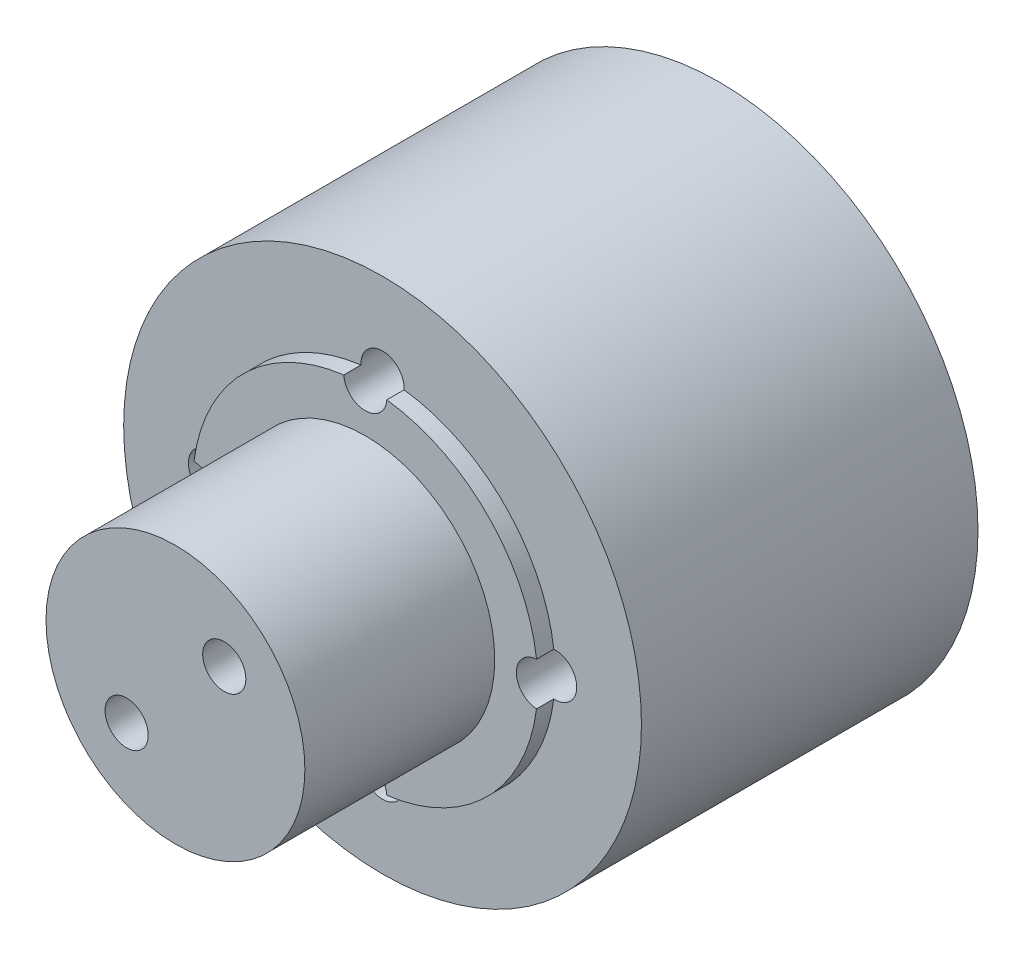
ISO-10303-21;
HEADER;
FILE_DESCRIPTION(('STEP AP214'),'2;1');
FILE_NAME('part.step','',(''),(''),'','','');
FILE_SCHEMA(('AUTOMOTIVE_DESIGN { 1 0 10303 214 1 1 1 1 }'));
ENDSEC;
DATA;
#1=APPLICATION_CONTEXT('core data for automotive mechanical design processes');
#2=APPLICATION_PROTOCOL_DEFINITION('international standard','automotive_design',2000,#1);
#3=PRODUCT_CONTEXT('',#1,'mechanical');
#4=PRODUCT('Part','Part','',(#3));
#5=PRODUCT_RELATED_PRODUCT_CATEGORY('part','',(#4));
#6=PRODUCT_DEFINITION_FORMATION('','',#4);
#7=PRODUCT_DEFINITION_CONTEXT('part definition',#1,'design');
#8=PRODUCT_DEFINITION('design','',#6,#7);
#9=PRODUCT_DEFINITION_SHAPE('','',#8);
#10=(LENGTH_UNIT() NAMED_UNIT(*) SI_UNIT(.MILLI.,.METRE.));
#11=(NAMED_UNIT(*) PLANE_ANGLE_UNIT() SI_UNIT($,.RADIAN.));
#12=(NAMED_UNIT(*) SI_UNIT($,.STERADIAN.) SOLID_ANGLE_UNIT());
#13=UNCERTAINTY_MEASURE_WITH_UNIT(LENGTH_MEASURE(1.E-05),#10,'distance_accuracy_value','');
#14=(GEOMETRIC_REPRESENTATION_CONTEXT(3) GLOBAL_UNCERTAINTY_ASSIGNED_CONTEXT((#13)) GLOBAL_UNIT_ASSIGNED_CONTEXT((#10,
#11,#12)) REPRESENTATION_CONTEXT('',''));
#15=CARTESIAN_POINT('',(0.,0.,0.));
#16=DIRECTION('',(0.,0.,1.));
#17=DIRECTION('',(1.,0.,0.));
#18=AXIS2_PLACEMENT_3D('',#15,#16,#17);
#19=CARTESIAN_POINT('',(0.,0.,20.5));
#20=DIRECTION('',(0.,0.,-1.));
#21=DIRECTION('',(-1.,0.,0.));
#22=AXIS2_PLACEMENT_3D('',#19,#20,#21);
#23=CYLINDRICAL_SURFACE('',#22,10.);
#24=CARTESIAN_POINT('',(0.,0.,19.5));
#25=DIRECTION('',(0.,0.,1.));
#26=DIRECTION('',(1.,0.,0.));
#27=AXIS2_PLACEMENT_3D('',#24,#25,#26);
#28=CIRCLE('',#27,10.);
#29=CARTESIAN_POINT('',(9.921875,1.24755620489619,19.5));
#30=VERTEX_POINT('',#29);
#31=CARTESIAN_POINT('',(1.2475562048962,9.921875,19.5));
#32=VERTEX_POINT('',#31);
#33=EDGE_CURVE('E180',#30,#32,#28,.T.);
#34=ORIENTED_EDGE('',*,*,#33,.T.);
#35=DIRECTION('',(0.,0.,-1.));
#36=VECTOR('',#35,1.);
#37=CARTESIAN_POINT('',(1.24755620489619,9.921875,15.75));
#38=LINE('',#37,#36);
#39=CARTESIAN_POINT('',(1.24755620489619,9.921875,20.5));
#40=VERTEX_POINT('',#39);
#41=EDGE_CURVE('E54',#32,#40,#38,.F.);
#42=ORIENTED_EDGE('',*,*,#41,.T.);
#43=CARTESIAN_POINT('',(0.,0.,20.5));
#44=DIRECTION('',(0.,0.,1.));
#45=DIRECTION('',(1.,0.,0.));
#46=AXIS2_PLACEMENT_3D('',#43,#44,#45);
#47=CIRCLE('',#46,10.);
#48=CARTESIAN_POINT('',(9.921875,1.24755620489619,20.5));
#49=VERTEX_POINT('',#48);
#50=EDGE_CURVE('E174',#49,#40,#47,.T.);
#51=ORIENTED_EDGE('',*,*,#50,.F.);
#52=DIRECTION('',(0.,0.,-1.));
#53=VECTOR('',#52,1.);
#54=CARTESIAN_POINT('',(9.921875,1.24755620489619,15.75));
#55=LINE('',#54,#53);
#56=EDGE_CURVE('E193',#49,#30,#55,.T.);
#57=ORIENTED_EDGE('',*,*,#56,.T.);
#58=EDGE_LOOP('',(#34,#42,#51,#57));
#59=FACE_BOUND('',#58,.T.);
#60=ADVANCED_FACE('F39',(#59),#23,.T.);
#61=CARTESIAN_POINT('',(-1.24755620489619,9.921875,20.5));
#62=VERTEX_POINT('',#61);
#63=CARTESIAN_POINT('',(-9.921875,1.2475562048962,20.5));
#64=VERTEX_POINT('',#63);
#65=EDGE_CURVE('E175',#62,#64,#47,.T.);
#66=ORIENTED_EDGE('',*,*,#65,.F.);
#67=DIRECTION('',(0.,0.,-1.));
#68=VECTOR('',#67,1.);
#69=CARTESIAN_POINT('',(-1.24755620489619,9.921875,15.75));
#70=LINE('',#69,#68);
#71=CARTESIAN_POINT('',(-1.2475562048962,9.921875,19.5));
#72=VERTEX_POINT('',#71);
#73=EDGE_CURVE('E135',#62,#72,#70,.T.);
#74=ORIENTED_EDGE('',*,*,#73,.T.);
#75=CARTESIAN_POINT('',(-9.921875,1.2475562048962,19.5));
#76=VERTEX_POINT('',#75);
#77=EDGE_CURVE('E181',#72,#76,#28,.T.);
#78=ORIENTED_EDGE('',*,*,#77,.T.);
#79=DIRECTION('',(0.,0.,-1.));
#80=VECTOR('',#79,1.);
#81=CARTESIAN_POINT('',(-9.921875,1.24755620489619,15.75));
#82=LINE('',#81,#80);
#83=EDGE_CURVE('E11',#76,#64,#82,.F.);
#84=ORIENTED_EDGE('',*,*,#83,.T.);
#85=EDGE_LOOP('',(#66,#74,#78,#84));
#86=FACE_BOUND('',#85,.T.);
#87=ADVANCED_FACE('F221',(#86),#23,.T.);
#88=CARTESIAN_POINT('',(1.24755620489619,-9.921875,19.5));
#89=VERTEX_POINT('',#88);
#90=CARTESIAN_POINT('',(9.921875,-1.2475562048962,19.5));
#91=VERTEX_POINT('',#90);
#92=EDGE_CURVE('E176',#89,#91,#28,.T.);
#93=ORIENTED_EDGE('',*,*,#92,.T.);
#94=DIRECTION('',(0.,0.,-1.));
#95=VECTOR('',#94,1.);
#96=CARTESIAN_POINT('',(9.921875,-1.24755620489619,15.75));
#97=LINE('',#96,#95);
#98=CARTESIAN_POINT('',(9.921875,-1.2475562048962,20.5));
#99=VERTEX_POINT('',#98);
#100=EDGE_CURVE('E196',#91,#99,#97,.F.);
#101=ORIENTED_EDGE('',*,*,#100,.T.);
#102=CARTESIAN_POINT('',(1.24755620489619,-9.921875,20.5));
#103=VERTEX_POINT('',#102);
#104=EDGE_CURVE('E170',#103,#99,#47,.T.);
#105=ORIENTED_EDGE('',*,*,#104,.F.);
#106=DIRECTION('',(0.,0.,-1.));
#107=VECTOR('',#106,1.);
#108=CARTESIAN_POINT('',(1.24755620489619,-9.921875,15.75));
#109=LINE('',#108,#107);
#110=EDGE_CURVE('E185',#103,#89,#109,.T.);
#111=ORIENTED_EDGE('',*,*,#110,.T.);
#112=EDGE_LOOP('',(#93,#101,#105,#111));
#113=FACE_BOUND('',#112,.T.);
#114=ADVANCED_FACE('F230',(#113),#23,.T.);
#115=CARTESIAN_POINT('',(0.,0.,20.5));
#116=DIRECTION('',(0.,0.,1.));
#117=DIRECTION('',(1.,0.,0.));
#118=AXIS2_PLACEMENT_3D('',#115,#116,#117);
#119=PLANE('',#118);
#120=CARTESIAN_POINT('',(0.,10.,20.5));
#121=DIRECTION('',(0.,0.,1.));
#122=DIRECTION('',(1.,0.,0.));
#123=AXIS2_PLACEMENT_3D('',#120,#121,#122);
#124=CIRCLE('',#123,1.24999999999999);
#125=EDGE_CURVE('E139',#62,#40,#124,.T.);
#126=ORIENTED_EDGE('',*,*,#125,.F.);
#127=ORIENTED_EDGE('',*,*,#65,.T.);
#128=CARTESIAN_POINT('',(-10.,0.,20.5));
#129=DIRECTION('',(0.,0.,1.));
#130=DIRECTION('',(1.,0.,0.));
#131=AXIS2_PLACEMENT_3D('',#128,#129,#130);
#132=CIRCLE('',#131,1.24999999999999);
#133=CARTESIAN_POINT('',(-9.921875,-1.24755620489619,20.5));
#134=VERTEX_POINT('',#133);
#135=EDGE_CURVE('E145',#134,#64,#132,.T.);
#136=ORIENTED_EDGE('',*,*,#135,.F.);
#137=CARTESIAN_POINT('',(-1.2475562048962,-9.921875,20.5));
#138=VERTEX_POINT('',#137);
#139=EDGE_CURVE('E179',#134,#138,#47,.T.);
#140=ORIENTED_EDGE('',*,*,#139,.T.);
#141=CARTESIAN_POINT('',(0.,-10.,20.5));
#142=DIRECTION('',(0.,0.,1.));
#143=DIRECTION('',(1.,0.,0.));
#144=AXIS2_PLACEMENT_3D('',#141,#142,#143);
#145=CIRCLE('',#144,1.24999999999999);
#146=EDGE_CURVE('E160',#103,#138,#145,.T.);
#147=ORIENTED_EDGE('',*,*,#146,.F.);
#148=ORIENTED_EDGE('',*,*,#104,.T.);
#149=CARTESIAN_POINT('',(10.,0.,20.5));
#150=DIRECTION('',(0.,0.,1.));
#151=DIRECTION('',(1.,0.,0.));
#152=AXIS2_PLACEMENT_3D('',#149,#150,#151);
#153=CIRCLE('',#152,1.24999999999999);
#154=EDGE_CURVE('E153',#49,#99,#153,.T.);
#155=ORIENTED_EDGE('',*,*,#154,.F.);
#156=ORIENTED_EDGE('',*,*,#50,.T.);
#157=EDGE_LOOP('',(#126,#127,#136,#140,#147,#148,#155,#156));
#158=FACE_BOUND('',#157,.T.);
#159=CARTESIAN_POINT('',(0.,0.,20.5));
#160=DIRECTION('',(0.,0.,1.));
#161=DIRECTION('',(1.,0.,0.));
#162=AXIS2_PLACEMENT_3D('',#159,#160,#161);
#163=CIRCLE('',#162,7.5);
#164=CARTESIAN_POINT('',(7.5,0.,20.5));
#165=VERTEX_POINT('',#164);
#166=EDGE_CURVE('E163',#165,#165,#163,.T.);
#167=ORIENTED_EDGE('',*,*,#166,.F.);
#168=EDGE_LOOP('',(#167));
#169=FACE_BOUND('',#168,.T.);
#170=ADVANCED_FACE('F224',(#158,#169),#119,.T.);
#171=CARTESIAN_POINT('',(0.,0.,19.5));
#172=DIRECTION('',(0.,0.,1.));
#173=DIRECTION('',(1.,0.,0.));
#174=AXIS2_PLACEMENT_3D('',#171,#172,#173);
#175=PLANE('',#174);
#176=CARTESIAN_POINT('',(0.,10.,19.5));
#177=DIRECTION('',(0.,0.,1.));
#178=DIRECTION('',(1.,0.,0.));
#179=AXIS2_PLACEMENT_3D('',#176,#177,#178);
#180=CIRCLE('',#179,1.24999999999999);
#181=EDGE_CURVE('E133',#32,#72,#180,.T.);
#182=ORIENTED_EDGE('',*,*,#181,.F.);
#183=ORIENTED_EDGE('',*,*,#33,.F.);
#184=CARTESIAN_POINT('',(10.,0.,19.5));
#185=DIRECTION('',(0.,0.,1.));
#186=DIRECTION('',(1.,0.,0.));
#187=AXIS2_PLACEMENT_3D('',#184,#185,#186);
#188=CIRCLE('',#187,1.24999999999999);
#189=EDGE_CURVE('E151',#91,#30,#188,.T.);
#190=ORIENTED_EDGE('',*,*,#189,.F.);
#191=ORIENTED_EDGE('',*,*,#92,.F.);
#192=CARTESIAN_POINT('',(0.,-10.,19.5));
#193=DIRECTION('',(0.,0.,1.));
#194=DIRECTION('',(1.,0.,0.));
#195=AXIS2_PLACEMENT_3D('',#192,#193,#194);
#196=CIRCLE('',#195,1.24999999999999);
#197=CARTESIAN_POINT('',(-1.2475562048962,-9.921875,19.5));
#198=VERTEX_POINT('',#197);
#199=EDGE_CURVE('E158',#198,#89,#196,.T.);
#200=ORIENTED_EDGE('',*,*,#199,.F.);
#201=CARTESIAN_POINT('',(-9.921875,-1.24755620489619,19.5));
#202=VERTEX_POINT('',#201);
#203=EDGE_CURVE('E167',#202,#198,#28,.T.);
#204=ORIENTED_EDGE('',*,*,#203,.F.);
#205=CARTESIAN_POINT('',(-10.,0.,19.5));
#206=DIRECTION('',(0.,0.,1.));
#207=DIRECTION('',(1.,0.,0.));
#208=AXIS2_PLACEMENT_3D('',#205,#206,#207);
#209=CIRCLE('',#208,1.24999999999999);
#210=EDGE_CURVE('E62',#76,#202,#209,.T.);
#211=ORIENTED_EDGE('',*,*,#210,.F.);
#212=ORIENTED_EDGE('',*,*,#77,.F.);
#213=EDGE_LOOP('',(#182,#183,#190,#191,#200,#204,#211,#212));
#214=FACE_BOUND('',#213,.T.);
#215=CARTESIAN_POINT('',(0.,0.,19.5));
#216=DIRECTION('',(0.,0.,1.));
#217=DIRECTION('',(1.,0.,0.));
#218=AXIS2_PLACEMENT_3D('',#215,#216,#217);
#219=CIRCLE('',#218,15.);
#220=CARTESIAN_POINT('',(15.,0.,19.5));
#221=VERTEX_POINT('',#220);
#222=EDGE_CURVE('E182',#221,#221,#219,.T.);
#223=ORIENTED_EDGE('',*,*,#222,.T.);
#224=EDGE_LOOP('',(#223));
#225=FACE_BOUND('',#224,.T.);
#226=ADVANCED_FACE('F206',(#214,#225),#175,.T.);
#227=CARTESIAN_POINT('',(0.,0.,19.5));
#228=DIRECTION('',(0.,0.,-1.));
#229=DIRECTION('',(-1.,0.,0.));
#230=AXIS2_PLACEMENT_3D('',#227,#228,#229);
#231=CYLINDRICAL_SURFACE('',#230,15.);
#232=ORIENTED_EDGE('',*,*,#222,.F.);
#233=EDGE_LOOP('',(#232));
#234=FACE_BOUND('',#233,.T.);
#235=CARTESIAN_POINT('',(0.,0.,0.));
#236=DIRECTION('',(0.,0.,1.));
#237=DIRECTION('',(1.,0.,0.));
#238=AXIS2_PLACEMENT_3D('',#235,#236,#237);
#239=CIRCLE('',#238,15.);
#240=CARTESIAN_POINT('',(15.,0.,0.));
#241=VERTEX_POINT('',#240);
#242=EDGE_CURVE('E173',#241,#241,#239,.T.);
#243=ORIENTED_EDGE('',*,*,#242,.T.);
#244=EDGE_LOOP('',(#243));
#245=FACE_BOUND('',#244,.T.);
#246=ADVANCED_FACE('F41',(#234,#245),#231,.T.);
#247=CARTESIAN_POINT('',(0.,0.,0.));
#248=DIRECTION('',(0.,0.,1.));
#249=DIRECTION('',(1.,0.,0.));
#250=AXIS2_PLACEMENT_3D('',#247,#248,#249);
#251=PLANE('',#250);
#252=CARTESIAN_POINT('',(0.,10.,0.));
#253=DIRECTION('',(0.,0.,-1.));
#254=DIRECTION('',(-1.,0.,0.));
#255=AXIS2_PLACEMENT_3D('',#252,#253,#254);
#256=CIRCLE('',#255,1.25);
#257=CARTESIAN_POINT('',(-1.25,10.,0.));
#258=VERTEX_POINT('',#257);
#259=EDGE_CURVE('E130',#258,#258,#256,.T.);
#260=ORIENTED_EDGE('',*,*,#259,.F.);
#261=EDGE_LOOP('',(#260));
#262=FACE_BOUND('',#261,.T.);
#263=CARTESIAN_POINT('',(-10.,0.,0.));
#264=DIRECTION('',(0.,0.,-1.));
#265=DIRECTION('',(-1.,0.,0.));
#266=AXIS2_PLACEMENT_3D('',#263,#264,#265);
#267=CIRCLE('',#266,1.25);
#268=CARTESIAN_POINT('',(-11.25,0.,0.));
#269=VERTEX_POINT('',#268);
#270=EDGE_CURVE('E141',#269,#269,#267,.T.);
#271=ORIENTED_EDGE('',*,*,#270,.F.);
#272=EDGE_LOOP('',(#271));
#273=FACE_BOUND('',#272,.T.);
#274=CARTESIAN_POINT('',(10.,0.,0.));
#275=DIRECTION('',(0.,0.,-1.));
#276=DIRECTION('',(-1.,0.,0.));
#277=AXIS2_PLACEMENT_3D('',#274,#275,#276);
#278=CIRCLE('',#277,1.25);
#279=CARTESIAN_POINT('',(8.75,0.,0.));
#280=VERTEX_POINT('',#279);
#281=EDGE_CURVE('E148',#280,#280,#278,.T.);
#282=ORIENTED_EDGE('',*,*,#281,.F.);
#283=EDGE_LOOP('',(#282));
#284=FACE_BOUND('',#283,.T.);
#285=CARTESIAN_POINT('',(0.,-10.,0.));
#286=DIRECTION('',(0.,0.,-1.));
#287=DIRECTION('',(-1.,0.,0.));
#288=AXIS2_PLACEMENT_3D('',#285,#286,#287);
#289=CIRCLE('',#288,1.25);
#290=CARTESIAN_POINT('',(-1.25,-10.,0.));
#291=VERTEX_POINT('',#290);
#292=EDGE_CURVE('E155',#291,#291,#289,.T.);
#293=ORIENTED_EDGE('',*,*,#292,.F.);
#294=EDGE_LOOP('',(#293));
#295=FACE_BOUND('',#294,.T.);
#296=ORIENTED_EDGE('',*,*,#242,.F.);
#297=EDGE_LOOP('',(#296));
#298=FACE_BOUND('',#297,.T.);
#299=ADVANCED_FACE('F256',(#262,#273,#284,#295,#298),#251,.F.);
#300=ORIENTED_EDGE('',*,*,#139,.F.);
#301=DIRECTION('',(0.,0.,-1.));
#302=VECTOR('',#301,1.);
#303=CARTESIAN_POINT('',(-9.921875,-1.24755620489619,15.75));
#304=LINE('',#303,#302);
#305=EDGE_CURVE('E47',#134,#202,#304,.T.);
#306=ORIENTED_EDGE('',*,*,#305,.T.);
#307=ORIENTED_EDGE('',*,*,#203,.T.);
#308=DIRECTION('',(0.,0.,-1.));
#309=VECTOR('',#308,1.);
#310=CARTESIAN_POINT('',(-1.24755620489619,-9.921875,15.75));
#311=LINE('',#310,#309);
#312=EDGE_CURVE('E190',#198,#138,#311,.F.);
#313=ORIENTED_EDGE('',*,*,#312,.T.);
#314=EDGE_LOOP('',(#300,#306,#307,#313));
#315=FACE_BOUND('',#314,.T.);
#316=ADVANCED_FACE('F201',(#315),#23,.T.);
#317=CARTESIAN_POINT('',(0.,0.,31.5));
#318=DIRECTION('',(0.,0.,-1.));
#319=DIRECTION('',(-1.,0.,0.));
#320=AXIS2_PLACEMENT_3D('',#317,#318,#319);
#321=CYLINDRICAL_SURFACE('',#320,7.5);
#322=CARTESIAN_POINT('',(0.,0.,31.5));
#323=DIRECTION('',(0.,0.,1.));
#324=DIRECTION('',(1.,0.,0.));
#325=AXIS2_PLACEMENT_3D('',#322,#323,#324);
#326=CIRCLE('',#325,7.5);
#327=CARTESIAN_POINT('',(7.5,0.,31.5));
#328=VERTEX_POINT('',#327);
#329=EDGE_CURVE('E164',#328,#328,#326,.T.);
#330=ORIENTED_EDGE('',*,*,#329,.F.);
#331=EDGE_LOOP('',(#330));
#332=FACE_BOUND('',#331,.T.);
#333=ORIENTED_EDGE('',*,*,#166,.T.);
#334=EDGE_LOOP('',(#333));
#335=FACE_BOUND('',#334,.T.);
#336=ADVANCED_FACE('F255',(#332,#335),#321,.T.);
#337=CARTESIAN_POINT('',(0.,0.,31.5));
#338=DIRECTION('',(0.,0.,1.));
#339=DIRECTION('',(1.,0.,0.));
#340=AXIS2_PLACEMENT_3D('',#337,#338,#339);
#341=PLANE('',#340);
#342=CARTESIAN_POINT('',(-2.82842712474618,-2.82842712474619,31.5));
#343=DIRECTION('',(0.,0.,1.));
#344=DIRECTION('',(1.,0.,0.));
#345=AXIS2_PLACEMENT_3D('',#342,#343,#344);
#346=CIRCLE('',#345,1.24999999999999);
#347=CARTESIAN_POINT('',(-1.5784271247462,-2.82842712474619,31.5));
#348=VERTEX_POINT('',#347);
#349=EDGE_CURVE('E120',#348,#348,#346,.T.);
#350=ORIENTED_EDGE('',*,*,#349,.F.);
#351=EDGE_LOOP('',(#350));
#352=FACE_BOUND('',#351,.T.);
#353=CARTESIAN_POINT('',(2.82842712474618,2.8284271247462,31.5));
#354=DIRECTION('',(0.,0.,1.));
#355=DIRECTION('',(1.,0.,0.));
#356=AXIS2_PLACEMENT_3D('',#353,#354,#355);
#357=CIRCLE('',#356,1.24999999999999);
#358=CARTESIAN_POINT('',(4.07842712474617,2.8284271247462,31.5));
#359=VERTEX_POINT('',#358);
#360=EDGE_CURVE('E119',#359,#359,#357,.T.);
#361=ORIENTED_EDGE('',*,*,#360,.F.);
#362=EDGE_LOOP('',(#361));
#363=FACE_BOUND('',#362,.T.);
#364=ORIENTED_EDGE('',*,*,#329,.T.);
#365=EDGE_LOOP('',(#364));
#366=FACE_BOUND('',#365,.T.);
#367=ADVANCED_FACE('F244',(#352,#363,#366),#341,.T.);
#368=CARTESIAN_POINT('',(0.,-10.,0.));
#369=DIRECTION('',(0.,0.,-1.));
#370=DIRECTION('',(-1.,0.,0.));
#371=AXIS2_PLACEMENT_3D('',#368,#369,#370);
#372=CYLINDRICAL_SURFACE('',#371,1.24999999999999);
#373=ORIENTED_EDGE('',*,*,#292,.T.);
#374=EDGE_LOOP('',(#373));
#375=FACE_BOUND('',#374,.T.);
#376=ORIENTED_EDGE('',*,*,#199,.T.);
#377=ORIENTED_EDGE('',*,*,#110,.F.);
#378=ORIENTED_EDGE('',*,*,#146,.T.);
#379=ORIENTED_EDGE('',*,*,#312,.F.);
#380=EDGE_LOOP('',(#376,#377,#378,#379));
#381=FACE_BOUND('',#380,.T.);
#382=ADVANCED_FACE('F228',(#375,#381),#372,.F.);
#383=CARTESIAN_POINT('',(10.,0.,0.));
#384=DIRECTION('',(0.,0.,-1.));
#385=DIRECTION('',(-1.,0.,0.));
#386=AXIS2_PLACEMENT_3D('',#383,#384,#385);
#387=CYLINDRICAL_SURFACE('',#386,1.24999999999999);
#388=ORIENTED_EDGE('',*,*,#281,.T.);
#389=EDGE_LOOP('',(#388));
#390=FACE_BOUND('',#389,.T.);
#391=ORIENTED_EDGE('',*,*,#189,.T.);
#392=ORIENTED_EDGE('',*,*,#56,.F.);
#393=ORIENTED_EDGE('',*,*,#154,.T.);
#394=ORIENTED_EDGE('',*,*,#100,.F.);
#395=EDGE_LOOP('',(#391,#392,#393,#394));
#396=FACE_BOUND('',#395,.T.);
#397=ADVANCED_FACE('F233',(#390,#396),#387,.F.);
#398=CARTESIAN_POINT('',(-10.,0.,0.));
#399=DIRECTION('',(0.,0.,-1.));
#400=DIRECTION('',(-1.,0.,0.));
#401=AXIS2_PLACEMENT_3D('',#398,#399,#400);
#402=CYLINDRICAL_SURFACE('',#401,1.24999999999999);
#403=ORIENTED_EDGE('',*,*,#270,.T.);
#404=EDGE_LOOP('',(#403));
#405=FACE_BOUND('',#404,.T.);
#406=ORIENTED_EDGE('',*,*,#210,.T.);
#407=ORIENTED_EDGE('',*,*,#305,.F.);
#408=ORIENTED_EDGE('',*,*,#135,.T.);
#409=ORIENTED_EDGE('',*,*,#83,.F.);
#410=EDGE_LOOP('',(#406,#407,#408,#409));
#411=FACE_BOUND('',#410,.T.);
#412=ADVANCED_FACE('F235',(#405,#411),#402,.F.);
#413=CARTESIAN_POINT('',(0.,10.,0.));
#414=DIRECTION('',(0.,0.,-1.));
#415=DIRECTION('',(-1.,0.,0.));
#416=AXIS2_PLACEMENT_3D('',#413,#414,#415);
#417=CYLINDRICAL_SURFACE('',#416,1.24999999999999);
#418=ORIENTED_EDGE('',*,*,#125,.T.);
#419=ORIENTED_EDGE('',*,*,#41,.F.);
#420=ORIENTED_EDGE('',*,*,#181,.T.);
#421=ORIENTED_EDGE('',*,*,#73,.F.);
#422=EDGE_LOOP('',(#418,#419,#420,#421));
#423=FACE_BOUND('',#422,.T.);
#424=ORIENTED_EDGE('',*,*,#259,.T.);
#425=EDGE_LOOP('',(#424));
#426=FACE_BOUND('',#425,.T.);
#427=ADVANCED_FACE('F216',(#423,#426),#417,.F.);
#428=CARTESIAN_POINT('',(2.82842712474618,2.8284271247462,23.5));
#429=DIRECTION('',(0.,0.,1.));
#430=DIRECTION('',(1.,0.,0.));
#431=AXIS2_PLACEMENT_3D('',#428,#429,#430);
#432=CONICAL_SURFACE('',#431,1.25,1.02974425867665);
#433=CARTESIAN_POINT('',(2.82842712474618,2.8284271247462,22.7489242262155));
#434=VERTEX_POINT('',#433);
#435=VERTEX_LOOP('',#434);
#436=FACE_BOUND('',#435,.T.);
#437=CARTESIAN_POINT('',(2.82842712474618,2.8284271247462,23.5));
#438=DIRECTION('',(0.,0.,1.));
#439=DIRECTION('',(1.,0.,0.));
#440=AXIS2_PLACEMENT_3D('',#437,#438,#439);
#441=CIRCLE('',#440,1.25);
#442=CARTESIAN_POINT('',(4.07842712474618,2.8284271247462,23.5));
#443=VERTEX_POINT('',#442);
#444=EDGE_CURVE('E123',#443,#443,#441,.T.);
#445=ORIENTED_EDGE('',*,*,#444,.T.);
#446=EDGE_LOOP('',(#445));
#447=FACE_BOUND('',#446,.T.);
#448=ADVANCED_FACE('F285',(#436,#447),#432,.F.);
#449=CARTESIAN_POINT('',(2.82842712474618,2.8284271247462,31.5));
#450=DIRECTION('',(0.,0.,1.));
#451=DIRECTION('',(1.,0.,0.));
#452=AXIS2_PLACEMENT_3D('',#449,#450,#451);
#453=CYLINDRICAL_SURFACE('',#452,1.24999999999999);
#454=ORIENTED_EDGE('',*,*,#444,.F.);
#455=EDGE_LOOP('',(#454));
#456=FACE_BOUND('',#455,.T.);
#457=ORIENTED_EDGE('',*,*,#360,.T.);
#458=EDGE_LOOP('',(#457));
#459=FACE_BOUND('',#458,.T.);
#460=ADVANCED_FACE('F113',(#456,#459),#453,.F.);
#461=CARTESIAN_POINT('',(-2.82842712474618,-2.82842712474619,23.5));
#462=DIRECTION('',(0.,0.,1.));
#463=DIRECTION('',(1.,0.,0.));
#464=AXIS2_PLACEMENT_3D('',#461,#462,#463);
#465=CONICAL_SURFACE('',#464,1.25,1.02974425867665);
#466=CARTESIAN_POINT('',(-2.82842712474619,-2.82842712474619,22.7489242262155));
#467=VERTEX_POINT('',#466);
#468=VERTEX_LOOP('',#467);
#469=FACE_BOUND('',#468,.T.);
#470=CARTESIAN_POINT('',(-2.82842712474618,-2.82842712474619,23.5));
#471=DIRECTION('',(0.,0.,1.));
#472=DIRECTION('',(1.,0.,0.));
#473=AXIS2_PLACEMENT_3D('',#470,#471,#472);
#474=CIRCLE('',#473,1.25);
#475=CARTESIAN_POINT('',(-1.57842712474619,-2.82842712474619,23.5));
#476=VERTEX_POINT('',#475);
#477=EDGE_CURVE('E117',#476,#476,#474,.T.);
#478=ORIENTED_EDGE('',*,*,#477,.T.);
#479=EDGE_LOOP('',(#478));
#480=FACE_BOUND('',#479,.T.);
#481=ADVANCED_FACE('F109',(#469,#480),#465,.F.);
#482=CARTESIAN_POINT('',(-2.82842712474618,-2.82842712474619,31.5));
#483=DIRECTION('',(0.,0.,1.));
#484=DIRECTION('',(1.,0.,0.));
#485=AXIS2_PLACEMENT_3D('',#482,#483,#484);
#486=CYLINDRICAL_SURFACE('',#485,1.24999999999999);
#487=ORIENTED_EDGE('',*,*,#477,.F.);
#488=EDGE_LOOP('',(#487));
#489=FACE_BOUND('',#488,.T.);
#490=ORIENTED_EDGE('',*,*,#349,.T.);
#491=EDGE_LOOP('',(#490));
#492=FACE_BOUND('',#491,.T.);
#493=ADVANCED_FACE('F112',(#489,#492),#486,.F.);
#494=CLOSED_SHELL('',(#60,#87,#114,#170,#226,#246,#299,#316,#336,#367,#382,#397,#412,#427,#448,
#460,#481,#493));
#495=MANIFOLD_SOLID_BREP('B2',#494);
#496=ADVANCED_BREP_SHAPE_REPRESENTATION('',(#18,#495),#14);
#497=SHAPE_DEFINITION_REPRESENTATION(#9,#496);
ENDSEC;
END-ISO-10303-21;
